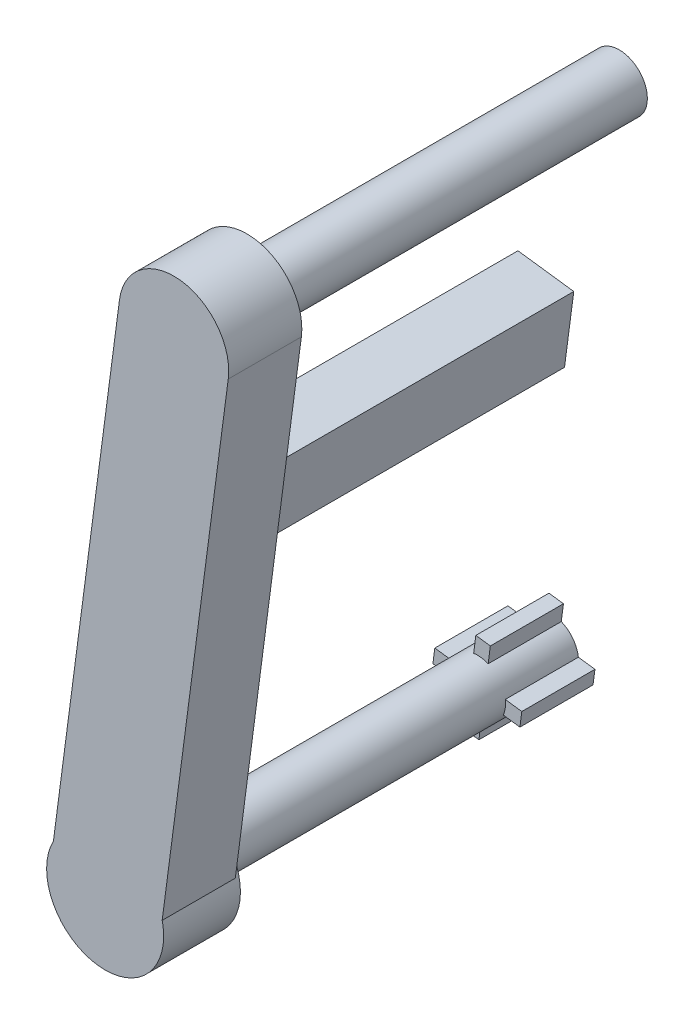
ISO-10303-21;
HEADER;
FILE_DESCRIPTION(('STEP AP214'),'2;1');
FILE_NAME('part.step','',(''),(''),'','','');
FILE_SCHEMA(('AUTOMOTIVE_DESIGN { 1 0 10303 214 1 1 1 1 }'));
ENDSEC;
DATA;
#1=APPLICATION_CONTEXT('core data for automotive mechanical design processes');
#2=APPLICATION_PROTOCOL_DEFINITION('international standard','automotive_design',2000,#1);
#3=PRODUCT_CONTEXT('',#1,'mechanical');
#4=PRODUCT('Part','Part','',(#3));
#5=PRODUCT_RELATED_PRODUCT_CATEGORY('part','',(#4));
#6=PRODUCT_DEFINITION_FORMATION('','',#4);
#7=PRODUCT_DEFINITION_CONTEXT('part definition',#1,'design');
#8=PRODUCT_DEFINITION('design','',#6,#7);
#9=PRODUCT_DEFINITION_SHAPE('','',#8);
#10=(LENGTH_UNIT() NAMED_UNIT(*) SI_UNIT(.MILLI.,.METRE.));
#11=(NAMED_UNIT(*) PLANE_ANGLE_UNIT() SI_UNIT($,.RADIAN.));
#12=(NAMED_UNIT(*) SI_UNIT($,.STERADIAN.) SOLID_ANGLE_UNIT());
#13=UNCERTAINTY_MEASURE_WITH_UNIT(LENGTH_MEASURE(1.E-05),#10,'distance_accuracy_value','');
#14=(GEOMETRIC_REPRESENTATION_CONTEXT(3) GLOBAL_UNCERTAINTY_ASSIGNED_CONTEXT((#13)) GLOBAL_UNIT_ASSIGNED_CONTEXT((#10,
#11,#12)) REPRESENTATION_CONTEXT('',''));
#15=CARTESIAN_POINT('',(0.,0.,0.));
#16=DIRECTION('',(0.,0.,1.));
#17=DIRECTION('',(1.,0.,0.));
#18=AXIS2_PLACEMENT_3D('',#15,#16,#17);
#19=CARTESIAN_POINT('',(9.39788583984373,71.3840300189143,-10.));
#20=DIRECTION('',(0.,0.,1.));
#21=DIRECTION('',(1.,0.,0.));
#22=AXIS2_PLACEMENT_3D('',#19,#20,#21);
#23=PLANE('',#22);
#24=CARTESIAN_POINT('',(0.,0.,-10.));
#25=DIRECTION('',(0.,0.,1.));
#26=DIRECTION('',(1.,0.,0.));
#27=AXIS2_PLACEMENT_3D('',#24,#25,#26);
#28=CIRCLE('',#27,8.);
#29=CARTESIAN_POINT('',(-7.07246691957423,3.73901212508444,-10.));
#30=VERTEX_POINT('',#29);
#31=CARTESIAN_POINT('',(7.79920600103294,1.78111924178366,-10.));
#32=VERTEX_POINT('',#31);
#33=EDGE_CURVE('E399',#30,#32,#28,.F.);
#34=ORIENTED_EDGE('',*,*,#33,.F.);
#35=DIRECTION('',(-0.130526192220052,-0.99144486137381,0.));
#36=VECTOR('',#35,1.);
#37=CARTESIAN_POINT('',(1.96204937954016,72.3629764605648,-10.));
#38=LINE('',#37,#36);
#39=CARTESIAN_POINT('',(1.96204937954016,72.3629764605648,-10.));
#40=VERTEX_POINT('',#39);
#41=EDGE_CURVE('E255',#40,#30,#38,.T.);
#42=ORIENTED_EDGE('',*,*,#41,.F.);
#43=CARTESIAN_POINT('',(9.39788583984373,71.3840300189143,-10.));
#44=DIRECTION('',(0.,0.,1.));
#45=DIRECTION('',(1.,0.,0.));
#46=AXIS2_PLACEMENT_3D('',#43,#44,#45);
#47=CIRCLE('',#46,7.5);
#48=CARTESIAN_POINT('',(16.8337223001473,70.405083577264,-10.));
#49=VERTEX_POINT('',#48);
#50=EDGE_CURVE('E252',#49,#40,#47,.T.);
#51=ORIENTED_EDGE('',*,*,#50,.F.);
#52=DIRECTION('',(0.130526192220052,0.99144486137381,0.));
#53=VECTOR('',#52,1.);
#54=CARTESIAN_POINT('',(16.8337223001473,70.405083577264,-10.));
#55=LINE('',#54,#53);
#56=EDGE_CURVE('E259',#32,#49,#55,.T.);
#57=ORIENTED_EDGE('',*,*,#56,.F.);
#58=EDGE_LOOP('',(#34,#42,#51,#57));
#59=FACE_BOUND('',#58,.T.);
#60=CARTESIAN_POINT('',(9.39788583984373,71.3840300189143,-10.));
#61=DIRECTION('',(0.,0.,1.));
#62=DIRECTION('',(1.,0.,0.));
#63=AXIS2_PLACEMENT_3D('',#60,#61,#62);
#64=CIRCLE('',#63,4.5);
#65=CARTESIAN_POINT('',(13.8978858398437,71.3840300189143,-10.));
#66=VERTEX_POINT('',#65);
#67=EDGE_CURVE('E51',#66,#66,#64,.F.);
#68=ORIENTED_EDGE('',*,*,#67,.F.);
#69=EDGE_LOOP('',(#68));
#70=FACE_BOUND('',#69,.T.);
#71=DIRECTION('',(-0.99144486137381,0.130526192220054,0.));
#72=VECTOR('',#71,1.);
#73=CARTESIAN_POINT('',(9.31874171836468,41.2868750668588,-10.));
#74=LINE('',#73,#72);
#75=CARTESIAN_POINT('',(9.31874171836468,41.2868750668588,-10.));
#76=VERTEX_POINT('',#75);
#77=CARTESIAN_POINT('',(1.68521115270317,42.2918484312379,-10.));
#78=VERTEX_POINT('',#77);
#79=EDGE_CURVE('E63',#76,#78,#74,.T.);
#80=ORIENTED_EDGE('',*,*,#79,.F.);
#81=DIRECTION('',(-0.130526192220054,-0.99144486137381,0.));
#82=VECTOR('',#81,1.);
#83=CARTESIAN_POINT('',(10.5848457828992,50.9038902221848,-10.));
#84=LINE('',#83,#82);
#85=CARTESIAN_POINT('',(10.5848457828992,50.9038902221848,-10.));
#86=VERTEX_POINT('',#85);
#87=EDGE_CURVE('E68',#86,#76,#84,.T.);
#88=ORIENTED_EDGE('',*,*,#87,.F.);
#89=DIRECTION('',(0.99144486137381,-0.130526192220053,0.));
#90=VECTOR('',#89,1.);
#91=CARTESIAN_POINT('',(2.95131521723769,51.9088635865639,-10.));
#92=LINE('',#91,#90);
#93=CARTESIAN_POINT('',(2.95131521723769,51.9088635865639,-10.));
#94=VERTEX_POINT('',#93);
#95=EDGE_CURVE('E206',#94,#86,#92,.T.);
#96=ORIENTED_EDGE('',*,*,#95,.F.);
#97=DIRECTION('',(0.130526192220054,0.99144486137381,0.));
#98=VECTOR('',#97,1.);
#99=CARTESIAN_POINT('',(1.68521115270317,42.2918484312379,-10.));
#100=LINE('',#99,#98);
#101=EDGE_CURVE('E209',#78,#94,#100,.T.);
#102=ORIENTED_EDGE('',*,*,#101,.F.);
#103=EDGE_LOOP('',(#80,#88,#96,#102));
#104=FACE_BOUND('',#103,.T.);
#105=ADVANCED_FACE('F47',(#59,#70,#104),#23,.F.);
#106=CARTESIAN_POINT('',(0.,0.,-10.5));
#107=DIRECTION('',(0.,0.,1.));
#108=DIRECTION('',(1.,0.,0.));
#109=AXIS2_PLACEMENT_3D('',#106,#107,#108);
#110=CYLINDRICAL_SURFACE('',#109,8.);
#111=DIRECTION('',(0.,0.,1.));
#112=VECTOR('',#111,1.);
#113=CARTESIAN_POINT('',(7.79920600103294,1.78111924178366,-10.));
#114=LINE('',#113,#112);
#115=CARTESIAN_POINT('',(7.79920600103294,1.78111924178366,0.));
#116=VERTEX_POINT('',#115);
#117=EDGE_CURVE('E272',#32,#116,#114,.T.);
#118=ORIENTED_EDGE('',*,*,#117,.T.);
#119=CARTESIAN_POINT('',(0.,0.,0.));
#120=DIRECTION('',(0.,0.,1.));
#121=DIRECTION('',(1.,0.,0.));
#122=AXIS2_PLACEMENT_3D('',#119,#120,#121);
#123=CIRCLE('',#122,8.);
#124=CARTESIAN_POINT('',(-7.07246691957424,3.73901212508439,0.));
#125=VERTEX_POINT('',#124);
#126=EDGE_CURVE('E349',#125,#116,#123,.T.);
#127=ORIENTED_EDGE('',*,*,#126,.F.);
#128=DIRECTION('',(0.,0.,1.));
#129=VECTOR('',#128,1.);
#130=CARTESIAN_POINT('',(-7.07246691957423,3.73901212508444,-10.));
#131=LINE('',#130,#129);
#132=EDGE_CURVE('E275',#30,#125,#131,.T.);
#133=ORIENTED_EDGE('',*,*,#132,.F.);
#134=ORIENTED_EDGE('',*,*,#33,.T.);
#135=EDGE_LOOP('',(#118,#127,#133,#134));
#136=FACE_BOUND('',#135,.T.);
#137=CARTESIAN_POINT('',(0.,0.,-10.5));
#138=DIRECTION('',(0.,0.,1.));
#139=DIRECTION('',(1.,0.,0.));
#140=AXIS2_PLACEMENT_3D('',#137,#138,#139);
#141=CIRCLE('',#140,8.);
#142=CARTESIAN_POINT('',(8.,0.,-10.5));
#143=VERTEX_POINT('',#142);
#144=EDGE_CURVE('E371',#143,#143,#141,.T.);
#145=ORIENTED_EDGE('',*,*,#144,.T.);
#146=EDGE_LOOP('',(#145));
#147=FACE_BOUND('',#146,.T.);
#148=ADVANCED_FACE('F49',(#136,#147),#110,.T.);
#149=CARTESIAN_POINT('',(0.,0.,-10.5));
#150=DIRECTION('',(0.,0.,1.));
#151=DIRECTION('',(1.,0.,0.));
#152=AXIS2_PLACEMENT_3D('',#149,#150,#151);
#153=PLANE('',#152);
#154=CARTESIAN_POINT('',(0.,0.,-10.5));
#155=DIRECTION('',(0.,0.,-1.));
#156=DIRECTION('',(-1.,0.,0.));
#157=AXIS2_PLACEMENT_3D('',#154,#155,#156);
#158=CIRCLE('',#157,3.85);
#159=CARTESIAN_POINT('',(-3.85,0.,-10.5));
#160=VERTEX_POINT('',#159);
#161=EDGE_CURVE('E367',#160,#160,#158,.T.);
#162=ORIENTED_EDGE('',*,*,#161,.F.);
#163=EDGE_LOOP('',(#162));
#164=FACE_BOUND('',#163,.T.);
#165=ORIENTED_EDGE('',*,*,#144,.F.);
#166=EDGE_LOOP('',(#165));
#167=FACE_BOUND('',#166,.T.);
#168=ADVANCED_FACE('F501',(#164,#167),#153,.F.);
#169=CARTESIAN_POINT('',(0.,0.,0.));
#170=DIRECTION('',(0.,0.,1.));
#171=DIRECTION('',(1.,0.,0.));
#172=AXIS2_PLACEMENT_3D('',#169,#170,#171);
#173=PLANE('',#172);
#174=ORIENTED_EDGE('',*,*,#126,.T.);
#175=DIRECTION('',(0.130526192220052,0.99144486137381,0.));
#176=VECTOR('',#175,1.);
#177=CARTESIAN_POINT('',(16.8337223001473,70.405083577264,0.));
#178=LINE('',#177,#176);
#179=CARTESIAN_POINT('',(16.8337223001473,70.405083577264,0.));
#180=VERTEX_POINT('',#179);
#181=EDGE_CURVE('E256',#116,#180,#178,.T.);
#182=ORIENTED_EDGE('',*,*,#181,.T.);
#183=CARTESIAN_POINT('',(9.39788583984373,71.3840300189143,0.));
#184=DIRECTION('',(0.,0.,1.));
#185=DIRECTION('',(1.,0.,0.));
#186=AXIS2_PLACEMENT_3D('',#183,#184,#185);
#187=CIRCLE('',#186,7.5);
#188=CARTESIAN_POINT('',(1.96204937954016,72.3629764605648,0.));
#189=VERTEX_POINT('',#188);
#190=EDGE_CURVE('E251',#180,#189,#187,.T.);
#191=ORIENTED_EDGE('',*,*,#190,.T.);
#192=DIRECTION('',(-0.130526192220052,-0.99144486137381,0.));
#193=VECTOR('',#192,1.);
#194=CARTESIAN_POINT('',(1.96204937954016,72.3629764605648,0.));
#195=LINE('',#194,#193);
#196=EDGE_CURVE('E265',#189,#125,#195,.T.);
#197=ORIENTED_EDGE('',*,*,#196,.T.);
#198=EDGE_LOOP('',(#174,#182,#191,#197));
#199=FACE_BOUND('',#198,.T.);
#200=ADVANCED_FACE('F552',(#199),#173,.T.);
#201=CARTESIAN_POINT('',(0.,0.,-70.5));
#202=DIRECTION('',(0.,0.,1.));
#203=DIRECTION('',(1.,0.,0.));
#204=AXIS2_PLACEMENT_3D('',#201,#202,#203);
#205=CYLINDRICAL_SURFACE('',#204,3.85);
#206=DIRECTION('',(0.,0.,1.));
#207=VECTOR('',#206,1.);
#208=CARTESIAN_POINT('',(3.8165816539488,0.506166453591544,-70.5));
#209=LINE('',#208,#207);
#210=CARTESIAN_POINT('',(3.8165816539488,0.506166453591544,-50.9));
#211=VERTEX_POINT('',#210);
#212=CARTESIAN_POINT('',(3.8165816539488,0.506166453591544,-60.9));
#213=VERTEX_POINT('',#212);
#214=EDGE_CURVE('E370',#211,#213,#209,.F.);
#215=ORIENTED_EDGE('',*,*,#214,.T.);
#216=CARTESIAN_POINT('',(0.,0.,-60.9));
#217=DIRECTION('',(0.,0.,1.));
#218=DIRECTION('',(1.,0.,0.));
#219=AXIS2_PLACEMENT_3D('',#216,#217,#218);
#220=CIRCLE('',#219,3.85);
#221=CARTESIAN_POINT('',(1.47672326915606,3.55552926950869,-60.9));
#222=VERTEX_POINT('',#221);
#223=EDGE_CURVE('E271',#222,#213,#220,.F.);
#224=ORIENTED_EDGE('',*,*,#223,.F.);
#225=DIRECTION('',(0.,0.,1.));
#226=VECTOR('',#225,1.);
#227=CARTESIAN_POINT('',(1.47672326915606,3.55552926950869,-70.5));
#228=LINE('',#227,#226);
#229=CARTESIAN_POINT('',(1.47672326915606,3.55552926950869,-50.9));
#230=VERTEX_POINT('',#229);
#231=EDGE_CURVE('E398',#222,#230,#228,.T.);
#232=ORIENTED_EDGE('',*,*,#231,.T.);
#233=CARTESIAN_POINT('',(0.,0.,-50.9));
#234=DIRECTION('',(0.,0.,1.));
#235=DIRECTION('',(1.,0.,0.));
#236=AXIS2_PLACEMENT_3D('',#233,#234,#235);
#237=CIRCLE('',#236,3.85);
#238=CARTESIAN_POINT('',(-0.50616645359156,3.8165816539488,-50.9));
#239=VERTEX_POINT('',#238);
#240=EDGE_CURVE('E383',#230,#239,#237,.T.);
#241=ORIENTED_EDGE('',*,*,#240,.T.);
#242=DIRECTION('',(0.,0.,1.));
#243=VECTOR('',#242,1.);
#244=CARTESIAN_POINT('',(-0.50616645359156,3.8165816539488,-70.5));
#245=LINE('',#244,#243);
#246=CARTESIAN_POINT('',(-0.506166453591559,3.8165816539488,-60.9));
#247=VERTEX_POINT('',#246);
#248=EDGE_CURVE('E395',#239,#247,#245,.F.);
#249=ORIENTED_EDGE('',*,*,#248,.T.);
#250=CARTESIAN_POINT('',(-3.5555292695087,1.47672326915604,-60.9));
#251=VERTEX_POINT('',#250);
#252=EDGE_CURVE('E448',#251,#247,#220,.F.);
#253=ORIENTED_EDGE('',*,*,#252,.F.);
#254=DIRECTION('',(0.,0.,1.));
#255=VECTOR('',#254,1.);
#256=CARTESIAN_POINT('',(-3.5555292695087,1.47672326915604,-70.5));
#257=LINE('',#256,#255);
#258=CARTESIAN_POINT('',(-3.5555292695087,1.47672326915604,-50.9));
#259=VERTEX_POINT('',#258);
#260=EDGE_CURVE('E392',#251,#259,#257,.T.);
#261=ORIENTED_EDGE('',*,*,#260,.T.);
#262=CARTESIAN_POINT('',(-3.8165816539488,-0.506166453591584,-50.9));
#263=VERTEX_POINT('',#262);
#264=EDGE_CURVE('E394',#259,#263,#237,.T.);
#265=ORIENTED_EDGE('',*,*,#264,.T.);
#266=DIRECTION('',(0.,0.,1.));
#267=VECTOR('',#266,1.);
#268=CARTESIAN_POINT('',(-3.8165816539488,-0.506166453591584,-70.5));
#269=LINE('',#268,#267);
#270=CARTESIAN_POINT('',(-3.8165816539488,-0.506166453591584,-60.9));
#271=VERTEX_POINT('',#270);
#272=EDGE_CURVE('E389',#263,#271,#269,.F.);
#273=ORIENTED_EDGE('',*,*,#272,.T.);
#274=CARTESIAN_POINT('',(-1.47672326915605,-3.5555292695087,-60.9));
#275=VERTEX_POINT('',#274);
#276=EDGE_CURVE('E282',#275,#271,#220,.F.);
#277=ORIENTED_EDGE('',*,*,#276,.F.);
#278=DIRECTION('',(0.,0.,1.));
#279=VECTOR('',#278,1.);
#280=CARTESIAN_POINT('',(-1.47672326915605,-3.5555292695087,-70.5));
#281=LINE('',#280,#279);
#282=CARTESIAN_POINT('',(-1.47672326915605,-3.5555292695087,-50.9));
#283=VERTEX_POINT('',#282);
#284=EDGE_CURVE('E387',#275,#283,#281,.T.);
#285=ORIENTED_EDGE('',*,*,#284,.T.);
#286=CARTESIAN_POINT('',(0.506166453591571,-3.8165816539488,-50.9));
#287=VERTEX_POINT('',#286);
#288=EDGE_CURVE('E384',#283,#287,#237,.T.);
#289=ORIENTED_EDGE('',*,*,#288,.T.);
#290=DIRECTION('',(0.,0.,1.));
#291=VECTOR('',#290,1.);
#292=CARTESIAN_POINT('',(0.506166453591571,-3.8165816539488,-70.5));
#293=LINE('',#292,#291);
#294=CARTESIAN_POINT('',(0.506166453591571,-3.8165816539488,-60.9));
#295=VERTEX_POINT('',#294);
#296=EDGE_CURVE('E382',#287,#295,#293,.F.);
#297=ORIENTED_EDGE('',*,*,#296,.T.);
#298=CARTESIAN_POINT('',(3.55552926950869,-1.47672326915608,-60.9));
#299=VERTEX_POINT('',#298);
#300=EDGE_CURVE('E279',#299,#295,#220,.F.);
#301=ORIENTED_EDGE('',*,*,#300,.F.);
#302=DIRECTION('',(0.,0.,1.));
#303=VECTOR('',#302,1.);
#304=CARTESIAN_POINT('',(3.55552926950869,-1.47672326915608,-70.5));
#305=LINE('',#304,#303);
#306=CARTESIAN_POINT('',(3.55552926950869,-1.47672326915608,-50.9));
#307=VERTEX_POINT('',#306);
#308=EDGE_CURVE('E378',#299,#307,#305,.T.);
#309=ORIENTED_EDGE('',*,*,#308,.T.);
#310=EDGE_CURVE('E380',#307,#211,#237,.T.);
#311=ORIENTED_EDGE('',*,*,#310,.T.);
#312=EDGE_LOOP('',(#215,#224,#232,#241,#249,#253,#261,#265,#273,#277,#285,#289,#297,#301,#309,#311));
#313=FACE_BOUND('',#312,.T.);
#314=ORIENTED_EDGE('',*,*,#161,.T.);
#315=EDGE_LOOP('',(#314));
#316=FACE_BOUND('',#315,.T.);
#317=ADVANCED_FACE('F411',(#313,#316),#205,.T.);
#318=CARTESIAN_POINT('',(5.81814297602283,-1.77460201469414,-50.9));
#319=DIRECTION('',(0.99144486137381,-0.130526192220052,0.));
#320=DIRECTION('',(0.130526192220052,0.99144486137381,0.));
#321=AXIS2_PLACEMENT_3D('',#318,#319,#320);
#322=PLANE('',#321);
#323=DIRECTION('',(-0.130526192220052,-0.99144486137381,0.));
#324=VECTOR('',#323,1.);
#325=CARTESIAN_POINT('',(5.81814297602283,-1.77460201469414,-60.9));
#326=LINE('',#325,#324);
#327=CARTESIAN_POINT('',(6.07919536046293,0.208287708053485,-60.9));
#328=VERTEX_POINT('',#327);
#329=CARTESIAN_POINT('',(5.81814297602283,-1.77460201469414,-60.9));
#330=VERTEX_POINT('',#329);
#331=EDGE_CURVE('E321',#328,#330,#326,.T.);
#332=ORIENTED_EDGE('',*,*,#331,.F.);
#333=DIRECTION('',(0.,0.,-1.));
#334=VECTOR('',#333,1.);
#335=CARTESIAN_POINT('',(6.07919536046293,0.208287708053485,-50.9));
#336=LINE('',#335,#334);
#337=CARTESIAN_POINT('',(6.07919536046293,0.208287708053485,-50.9));
#338=VERTEX_POINT('',#337);
#339=EDGE_CURVE('E316',#338,#328,#336,.T.);
#340=ORIENTED_EDGE('',*,*,#339,.F.);
#341=DIRECTION('',(-0.130526192220052,-0.99144486137381,0.));
#342=VECTOR('',#341,1.);
#343=CARTESIAN_POINT('',(5.81814297602283,-1.77460201469414,-50.9));
#344=LINE('',#343,#342);
#345=CARTESIAN_POINT('',(5.81814297602283,-1.77460201469414,-50.9));
#346=VERTEX_POINT('',#345);
#347=EDGE_CURVE('E289',#338,#346,#344,.T.);
#348=ORIENTED_EDGE('',*,*,#347,.T.);
#349=DIRECTION('',(0.,0.,-1.));
#350=VECTOR('',#349,1.);
#351=CARTESIAN_POINT('',(5.81814297602283,-1.77460201469414,-50.9));
#352=LINE('',#351,#350);
#353=EDGE_CURVE('E363',#346,#330,#352,.T.);
#354=ORIENTED_EDGE('',*,*,#353,.T.);
#355=EDGE_LOOP('',(#332,#340,#348,#354));
#356=FACE_BOUND('',#355,.T.);
#357=ADVANCED_FACE('F442',(#356),#322,.T.);
#358=CARTESIAN_POINT('',(0.,0.,-50.9));
#359=DIRECTION('',(0.,0.,1.));
#360=DIRECTION('',(1.,0.,0.));
#361=AXIS2_PLACEMENT_3D('',#358,#359,#360);
#362=PLANE('',#361);
#363=ORIENTED_EDGE('',*,*,#310,.F.);
#364=DIRECTION('',(-0.99144486137381,0.130526192220052,0.));
#365=VECTOR('',#364,1.);
#366=CARTESIAN_POINT('',(0.860918669153769,-1.12197105359388,-50.9));
#367=LINE('',#366,#365);
#368=EDGE_CURVE('E292',#346,#307,#367,.T.);
#369=ORIENTED_EDGE('',*,*,#368,.F.);
#370=ORIENTED_EDGE('',*,*,#347,.F.);
#371=DIRECTION('',(0.991444861373811,-0.130526192220051,0.));
#372=VECTOR('',#371,1.);
#373=CARTESIAN_POINT('',(6.07919536046293,0.208287708053485,-50.9));
#374=LINE('',#373,#372);
#375=EDGE_CURVE('E286',#211,#338,#374,.T.);
#376=ORIENTED_EDGE('',*,*,#375,.F.);
#377=EDGE_LOOP('',(#363,#369,#370,#376));
#378=FACE_BOUND('',#377,.T.);
#379=ADVANCED_FACE('F437',(#378),#362,.T.);
#380=CARTESIAN_POINT('',(6.07919536046293,0.208287708053485,-50.9));
#381=DIRECTION('',(0.130526192220051,0.991444861373811,0.));
#382=DIRECTION('',(-0.991444861373811,0.130526192220051,0.));
#383=AXIS2_PLACEMENT_3D('',#380,#381,#382);
#384=PLANE('',#383);
#385=ORIENTED_EDGE('',*,*,#214,.F.);
#386=ORIENTED_EDGE('',*,*,#375,.T.);
#387=ORIENTED_EDGE('',*,*,#339,.T.);
#388=DIRECTION('',(0.991444861373811,-0.130526192220051,0.));
#389=VECTOR('',#388,1.);
#390=CARTESIAN_POINT('',(6.07919536046293,0.208287708053485,-60.9));
#391=LINE('',#390,#389);
#392=EDGE_CURVE('E319',#213,#328,#391,.T.);
#393=ORIENTED_EDGE('',*,*,#392,.F.);
#394=EDGE_LOOP('',(#385,#386,#387,#393));
#395=FACE_BOUND('',#394,.T.);
#396=ADVANCED_FACE('F446',(#395),#384,.T.);
#397=CARTESIAN_POINT('',(0.860918669153769,-1.12197105359388,-50.9));
#398=DIRECTION('',(-0.130526192220052,-0.99144486137381,0.));
#399=DIRECTION('',(0.99144486137381,-0.130526192220052,0.));
#400=AXIS2_PLACEMENT_3D('',#397,#398,#399);
#401=PLANE('',#400);
#402=ORIENTED_EDGE('',*,*,#308,.F.);
#403=DIRECTION('',(-0.99144486137381,0.130526192220052,0.));
#404=VECTOR('',#403,1.);
#405=CARTESIAN_POINT('',(0.860918669153769,-1.12197105359388,-60.9));
#406=LINE('',#405,#404);
#407=EDGE_CURVE('E324',#330,#299,#406,.T.);
#408=ORIENTED_EDGE('',*,*,#407,.F.);
#409=ORIENTED_EDGE('',*,*,#353,.F.);
#410=ORIENTED_EDGE('',*,*,#368,.T.);
#411=EDGE_LOOP('',(#402,#408,#409,#410));
#412=FACE_BOUND('',#411,.T.);
#413=ADVANCED_FACE('F433',(#412),#401,.T.);
#414=CARTESIAN_POINT('',(-1.77460201469411,-5.81814297602284,-50.9));
#415=DIRECTION('',(-0.130526192220052,-0.99144486137381,0.));
#416=DIRECTION('',(0.99144486137381,-0.130526192220052,0.));
#417=AXIS2_PLACEMENT_3D('',#414,#415,#416);
#418=PLANE('',#417);
#419=DIRECTION('',(-0.99144486137381,0.130526192220052,0.));
#420=VECTOR('',#419,1.);
#421=CARTESIAN_POINT('',(-1.77460201469411,-5.81814297602284,-60.9));
#422=LINE('',#421,#420);
#423=CARTESIAN_POINT('',(0.208287708053507,-6.07919536046295,-60.9));
#424=VERTEX_POINT('',#423);
#425=CARTESIAN_POINT('',(-1.77460201469411,-5.81814297602284,-60.9));
#426=VERTEX_POINT('',#425);
#427=EDGE_CURVE('E329',#424,#426,#422,.T.);
#428=ORIENTED_EDGE('',*,*,#427,.F.);
#429=DIRECTION('',(0.,0.,-1.));
#430=VECTOR('',#429,1.);
#431=CARTESIAN_POINT('',(0.208287708053507,-6.07919536046295,-50.9));
#432=LINE('',#431,#430);
#433=CARTESIAN_POINT('',(0.208287708053507,-6.07919536046295,-50.9));
#434=VERTEX_POINT('',#433);
#435=EDGE_CURVE('E360',#434,#424,#432,.T.);
#436=ORIENTED_EDGE('',*,*,#435,.F.);
#437=DIRECTION('',(-0.99144486137381,0.130526192220052,0.));
#438=VECTOR('',#437,1.);
#439=CARTESIAN_POINT('',(-1.77460201469411,-5.81814297602284,-50.9));
#440=LINE('',#439,#438);
#441=CARTESIAN_POINT('',(-1.77460201469411,-5.81814297602284,-50.9));
#442=VERTEX_POINT('',#441);
#443=EDGE_CURVE('E297',#434,#442,#440,.T.);
#444=ORIENTED_EDGE('',*,*,#443,.T.);
#445=DIRECTION('',(0.,0.,-1.));
#446=VECTOR('',#445,1.);
#447=CARTESIAN_POINT('',(-1.77460201469411,-5.81814297602284,-50.9));
#448=LINE('',#447,#446);
#449=EDGE_CURVE('E358',#442,#426,#448,.T.);
#450=ORIENTED_EDGE('',*,*,#449,.T.);
#451=EDGE_LOOP('',(#428,#436,#444,#450));
#452=FACE_BOUND('',#451,.T.);
#453=ADVANCED_FACE('F425',(#452),#418,.T.);
#454=ORIENTED_EDGE('',*,*,#288,.F.);
#455=DIRECTION('',(0.130526192220052,0.99144486137381,0.));
#456=VECTOR('',#455,1.);
#457=CARTESIAN_POINT('',(-1.12197105359385,-0.860918669153784,-50.9));
#458=LINE('',#457,#456);
#459=EDGE_CURVE('E300',#442,#283,#458,.T.);
#460=ORIENTED_EDGE('',*,*,#459,.F.);
#461=ORIENTED_EDGE('',*,*,#443,.F.);
#462=DIRECTION('',(-0.130526192220052,-0.99144486137381,0.));
#463=VECTOR('',#462,1.);
#464=CARTESIAN_POINT('',(0.208287708053507,-6.07919536046295,-50.9));
#465=LINE('',#464,#463);
#466=EDGE_CURVE('E295',#287,#434,#465,.T.);
#467=ORIENTED_EDGE('',*,*,#466,.F.);
#468=EDGE_LOOP('',(#454,#460,#461,#467));
#469=FACE_BOUND('',#468,.T.);
#470=ADVANCED_FACE('F422',(#469),#362,.T.);
#471=CARTESIAN_POINT('',(0.208287708053507,-6.07919536046295,-50.9));
#472=DIRECTION('',(0.99144486137381,-0.130526192220052,0.));
#473=DIRECTION('',(0.130526192220052,0.99144486137381,0.));
#474=AXIS2_PLACEMENT_3D('',#471,#472,#473);
#475=PLANE('',#474);
#476=ORIENTED_EDGE('',*,*,#296,.F.);
#477=ORIENTED_EDGE('',*,*,#466,.T.);
#478=ORIENTED_EDGE('',*,*,#435,.T.);
#479=DIRECTION('',(-0.130526192220052,-0.99144486137381,0.));
#480=VECTOR('',#479,1.);
#481=CARTESIAN_POINT('',(0.208287708053507,-6.07919536046295,-60.9));
#482=LINE('',#481,#480);
#483=EDGE_CURVE('E327',#295,#424,#482,.T.);
#484=ORIENTED_EDGE('',*,*,#483,.F.);
#485=EDGE_LOOP('',(#476,#477,#478,#484));
#486=FACE_BOUND('',#485,.T.);
#487=ADVANCED_FACE('F419',(#486),#475,.T.);
#488=CARTESIAN_POINT('',(-1.12197105359385,-0.860918669153784,-50.9));
#489=DIRECTION('',(-0.99144486137381,0.130526192220052,0.));
#490=DIRECTION('',(-0.130526192220052,-0.99144486137381,0.));
#491=AXIS2_PLACEMENT_3D('',#488,#489,#490);
#492=PLANE('',#491);
#493=ORIENTED_EDGE('',*,*,#284,.F.);
#494=DIRECTION('',(0.130526192220052,0.99144486137381,0.));
#495=VECTOR('',#494,1.);
#496=CARTESIAN_POINT('',(-1.12197105359385,-0.860918669153784,-60.9));
#497=LINE('',#496,#495);
#498=EDGE_CURVE('E332',#426,#275,#497,.T.);
#499=ORIENTED_EDGE('',*,*,#498,.F.);
#500=ORIENTED_EDGE('',*,*,#449,.F.);
#501=ORIENTED_EDGE('',*,*,#459,.T.);
#502=EDGE_LOOP('',(#493,#499,#500,#501));
#503=FACE_BOUND('',#502,.T.);
#504=ADVANCED_FACE('F481',(#503),#492,.T.);
#505=CARTESIAN_POINT('',(-5.81814297602282,1.7746020146941,-50.9));
#506=DIRECTION('',(-0.99144486137381,0.130526192220052,0.));
#507=DIRECTION('',(-0.130526192220052,-0.99144486137381,0.));
#508=AXIS2_PLACEMENT_3D('',#505,#506,#507);
#509=PLANE('',#508);
#510=DIRECTION('',(0.130526192220052,0.99144486137381,0.));
#511=VECTOR('',#510,1.);
#512=CARTESIAN_POINT('',(-5.81814297602282,1.7746020146941,-60.9));
#513=LINE('',#512,#511);
#514=CARTESIAN_POINT('',(-6.07919536046293,-0.208287708053522,-60.9));
#515=VERTEX_POINT('',#514);
#516=CARTESIAN_POINT('',(-5.81814297602282,1.7746020146941,-60.9));
#517=VERTEX_POINT('',#516);
#518=EDGE_CURVE('E337',#515,#517,#513,.T.);
#519=ORIENTED_EDGE('',*,*,#518,.F.);
#520=DIRECTION('',(0.,0.,-1.));
#521=VECTOR('',#520,1.);
#522=CARTESIAN_POINT('',(-6.07919536046293,-0.208287708053522,-50.9));
#523=LINE('',#522,#521);
#524=CARTESIAN_POINT('',(-6.07919536046293,-0.208287708053522,-50.9));
#525=VERTEX_POINT('',#524);
#526=EDGE_CURVE('E355',#525,#515,#523,.T.);
#527=ORIENTED_EDGE('',*,*,#526,.F.);
#528=DIRECTION('',(0.130526192220052,0.99144486137381,0.));
#529=VECTOR('',#528,1.);
#530=CARTESIAN_POINT('',(-5.81814297602282,1.7746020146941,-50.9));
#531=LINE('',#530,#529);
#532=CARTESIAN_POINT('',(-5.81814297602282,1.7746020146941,-50.9));
#533=VERTEX_POINT('',#532);
#534=EDGE_CURVE('E305',#525,#533,#531,.T.);
#535=ORIENTED_EDGE('',*,*,#534,.T.);
#536=DIRECTION('',(0.,0.,-1.));
#537=VECTOR('',#536,1.);
#538=CARTESIAN_POINT('',(-5.81814297602282,1.7746020146941,-50.9));
#539=LINE('',#538,#537);
#540=EDGE_CURVE('E353',#533,#517,#539,.T.);
#541=ORIENTED_EDGE('',*,*,#540,.T.);
#542=EDGE_LOOP('',(#519,#527,#535,#541));
#543=FACE_BOUND('',#542,.T.);
#544=ADVANCED_FACE('F473',(#543),#509,.T.);
#545=ORIENTED_EDGE('',*,*,#264,.F.);
#546=DIRECTION('',(0.99144486137381,-0.130526192220052,0.));
#547=VECTOR('',#546,1.);
#548=CARTESIAN_POINT('',(-0.860918669153763,1.12197105359384,-50.9));
#549=LINE('',#548,#547);
#550=EDGE_CURVE('E308',#533,#259,#549,.T.);
#551=ORIENTED_EDGE('',*,*,#550,.F.);
#552=ORIENTED_EDGE('',*,*,#534,.F.);
#553=DIRECTION('',(-0.99144486137381,0.130526192220052,0.));
#554=VECTOR('',#553,1.);
#555=CARTESIAN_POINT('',(-6.07919536046293,-0.208287708053522,-50.9));
#556=LINE('',#555,#554);
#557=EDGE_CURVE('E303',#263,#525,#556,.T.);
#558=ORIENTED_EDGE('',*,*,#557,.F.);
#559=EDGE_LOOP('',(#545,#551,#552,#558));
#560=FACE_BOUND('',#559,.T.);
#561=ADVANCED_FACE('F476',(#560),#362,.T.);
#562=CARTESIAN_POINT('',(-6.07919536046293,-0.208287708053522,-50.9));
#563=DIRECTION('',(-0.130526192220052,-0.99144486137381,0.));
#564=DIRECTION('',(0.99144486137381,-0.130526192220052,0.));
#565=AXIS2_PLACEMENT_3D('',#562,#563,#564);
#566=PLANE('',#565);
#567=ORIENTED_EDGE('',*,*,#272,.F.);
#568=ORIENTED_EDGE('',*,*,#557,.T.);
#569=ORIENTED_EDGE('',*,*,#526,.T.);
#570=DIRECTION('',(-0.99144486137381,0.130526192220052,0.));
#571=VECTOR('',#570,1.);
#572=CARTESIAN_POINT('',(-6.07919536046293,-0.208287708053522,-60.9));
#573=LINE('',#572,#571);
#574=EDGE_CURVE('E335',#271,#515,#573,.T.);
#575=ORIENTED_EDGE('',*,*,#574,.F.);
#576=EDGE_LOOP('',(#567,#568,#569,#575));
#577=FACE_BOUND('',#576,.T.);
#578=ADVANCED_FACE('F479',(#577),#566,.T.);
#579=CARTESIAN_POINT('',(-0.860918669153763,1.12197105359384,-50.9));
#580=DIRECTION('',(0.130526192220052,0.99144486137381,0.));
#581=DIRECTION('',(-0.99144486137381,0.130526192220052,0.));
#582=AXIS2_PLACEMENT_3D('',#579,#580,#581);
#583=PLANE('',#582);
#584=ORIENTED_EDGE('',*,*,#260,.F.);
#585=DIRECTION('',(0.99144486137381,-0.130526192220052,0.));
#586=VECTOR('',#585,1.);
#587=CARTESIAN_POINT('',(-0.860918669153763,1.12197105359384,-60.9));
#588=LINE('',#587,#586);
#589=EDGE_CURVE('E340',#517,#251,#588,.T.);
#590=ORIENTED_EDGE('',*,*,#589,.F.);
#591=ORIENTED_EDGE('',*,*,#540,.F.);
#592=ORIENTED_EDGE('',*,*,#550,.T.);
#593=EDGE_LOOP('',(#584,#590,#591,#592));
#594=FACE_BOUND('',#593,.T.);
#595=ADVANCED_FACE('F467',(#594),#583,.T.);
#596=CARTESIAN_POINT('',(1.12197105359386,0.860918669153741,-50.9));
#597=DIRECTION('',(0.99144486137381,-0.130526192220052,0.));
#598=DIRECTION('',(0.130526192220052,0.99144486137381,0.));
#599=AXIS2_PLACEMENT_3D('',#596,#597,#598);
#600=PLANE('',#599);
#601=ORIENTED_EDGE('',*,*,#231,.F.);
#602=DIRECTION('',(-0.130526192220052,-0.99144486137381,0.));
#603=VECTOR('',#602,1.);
#604=CARTESIAN_POINT('',(1.12197105359386,0.860918669153741,-60.9));
#605=LINE('',#604,#603);
#606=CARTESIAN_POINT('',(1.77460201469412,5.81814297602281,-60.9));
#607=VERTEX_POINT('',#606);
#608=EDGE_CURVE('E281',#607,#222,#605,.T.);
#609=ORIENTED_EDGE('',*,*,#608,.F.);
#610=DIRECTION('',(0.,0.,-1.));
#611=VECTOR('',#610,1.);
#612=CARTESIAN_POINT('',(1.77460201469412,5.81814297602281,-50.9));
#613=LINE('',#612,#611);
#614=CARTESIAN_POINT('',(1.77460201469412,5.81814297602281,-50.9));
#615=VERTEX_POINT('',#614);
#616=EDGE_CURVE('E347',#615,#607,#613,.T.);
#617=ORIENTED_EDGE('',*,*,#616,.F.);
#618=DIRECTION('',(-0.130526192220052,-0.99144486137381,0.));
#619=VECTOR('',#618,1.);
#620=CARTESIAN_POINT('',(1.12197105359386,0.860918669153741,-50.9));
#621=LINE('',#620,#619);
#622=EDGE_CURVE('E283',#615,#230,#621,.T.);
#623=ORIENTED_EDGE('',*,*,#622,.T.);
#624=EDGE_LOOP('',(#601,#609,#617,#623));
#625=FACE_BOUND('',#624,.T.);
#626=ADVANCED_FACE('F451',(#625),#600,.T.);
#627=CARTESIAN_POINT('',(-0.208287708053501,6.07919536046291,-50.9));
#628=DIRECTION('',(-0.99144486137381,0.130526192220052,0.));
#629=DIRECTION('',(-0.130526192220052,-0.99144486137381,0.));
#630=AXIS2_PLACEMENT_3D('',#627,#628,#629);
#631=PLANE('',#630);
#632=ORIENTED_EDGE('',*,*,#248,.F.);
#633=DIRECTION('',(0.130526192220052,0.99144486137381,0.));
#634=VECTOR('',#633,1.);
#635=CARTESIAN_POINT('',(-0.208287708053501,6.07919536046291,-50.9));
#636=LINE('',#635,#634);
#637=CARTESIAN_POINT('',(-0.208287708053501,6.07919536046291,-50.9));
#638=VERTEX_POINT('',#637);
#639=EDGE_CURVE('E311',#239,#638,#636,.T.);
#640=ORIENTED_EDGE('',*,*,#639,.T.);
#641=DIRECTION('',(0.,0.,-1.));
#642=VECTOR('',#641,1.);
#643=CARTESIAN_POINT('',(-0.208287708053501,6.07919536046291,-50.9));
#644=LINE('',#643,#642);
#645=CARTESIAN_POINT('',(-0.208287708053501,6.07919536046291,-60.9));
#646=VERTEX_POINT('',#645);
#647=EDGE_CURVE('E350',#638,#646,#644,.T.);
#648=ORIENTED_EDGE('',*,*,#647,.T.);
#649=DIRECTION('',(0.130526192220052,0.99144486137381,0.));
#650=VECTOR('',#649,1.);
#651=CARTESIAN_POINT('',(-0.208287708053501,6.07919536046291,-60.9));
#652=LINE('',#651,#650);
#653=EDGE_CURVE('E343',#247,#646,#652,.T.);
#654=ORIENTED_EDGE('',*,*,#653,.F.);
#655=EDGE_LOOP('',(#632,#640,#648,#654));
#656=FACE_BOUND('',#655,.T.);
#657=ADVANCED_FACE('F463',(#656),#631,.T.);
#658=ORIENTED_EDGE('',*,*,#240,.F.);
#659=ORIENTED_EDGE('',*,*,#622,.F.);
#660=DIRECTION('',(0.99144486137381,-0.130526192220052,0.));
#661=VECTOR('',#660,1.);
#662=CARTESIAN_POINT('',(1.77460201469412,5.81814297602281,-50.9));
#663=LINE('',#662,#661);
#664=EDGE_CURVE('E313',#638,#615,#663,.T.);
#665=ORIENTED_EDGE('',*,*,#664,.F.);
#666=ORIENTED_EDGE('',*,*,#639,.F.);
#667=EDGE_LOOP('',(#658,#659,#665,#666));
#668=FACE_BOUND('',#667,.T.);
#669=ADVANCED_FACE('F460',(#668),#362,.T.);
#670=CARTESIAN_POINT('',(0.,0.,-60.9));
#671=DIRECTION('',(0.,0.,1.));
#672=DIRECTION('',(1.,0.,0.));
#673=AXIS2_PLACEMENT_3D('',#670,#671,#672);
#674=PLANE('',#673);
#675=ORIENTED_EDGE('',*,*,#608,.T.);
#676=ORIENTED_EDGE('',*,*,#223,.T.);
#677=ORIENTED_EDGE('',*,*,#392,.T.);
#678=ORIENTED_EDGE('',*,*,#331,.T.);
#679=ORIENTED_EDGE('',*,*,#407,.T.);
#680=ORIENTED_EDGE('',*,*,#300,.T.);
#681=ORIENTED_EDGE('',*,*,#483,.T.);
#682=ORIENTED_EDGE('',*,*,#427,.T.);
#683=ORIENTED_EDGE('',*,*,#498,.T.);
#684=ORIENTED_EDGE('',*,*,#276,.T.);
#685=ORIENTED_EDGE('',*,*,#574,.T.);
#686=ORIENTED_EDGE('',*,*,#518,.T.);
#687=ORIENTED_EDGE('',*,*,#589,.T.);
#688=ORIENTED_EDGE('',*,*,#252,.T.);
#689=ORIENTED_EDGE('',*,*,#653,.T.);
#690=DIRECTION('',(0.99144486137381,-0.130526192220052,0.));
#691=VECTOR('',#690,1.);
#692=CARTESIAN_POINT('',(1.77460201469412,5.81814297602281,-60.9));
#693=LINE('',#692,#691);
#694=EDGE_CURVE('E287',#646,#607,#693,.T.);
#695=ORIENTED_EDGE('',*,*,#694,.T.);
#696=EDGE_LOOP('',(#675,#676,#677,#678,#679,#680,#681,#682,#683,#684,#685,#686,#687,#688,#689,#695));
#697=FACE_BOUND('',#696,.T.);
#698=ADVANCED_FACE('F428',(#697),#674,.F.);
#699=CARTESIAN_POINT('',(1.77460201469412,5.81814297602281,-50.9));
#700=DIRECTION('',(0.130526192220052,0.99144486137381,0.));
#701=DIRECTION('',(-0.99144486137381,0.130526192220052,0.));
#702=AXIS2_PLACEMENT_3D('',#699,#700,#701);
#703=PLANE('',#702);
#704=ORIENTED_EDGE('',*,*,#694,.F.);
#705=ORIENTED_EDGE('',*,*,#647,.F.);
#706=ORIENTED_EDGE('',*,*,#664,.T.);
#707=ORIENTED_EDGE('',*,*,#616,.T.);
#708=EDGE_LOOP('',(#704,#705,#706,#707));
#709=FACE_BOUND('',#708,.T.);
#710=ADVANCED_FACE('F457',(#709),#703,.T.);
#711=CARTESIAN_POINT('',(9.39788583984373,71.3840300189143,-10.));
#712=DIRECTION('',(0.,0.,1.));
#713=DIRECTION('',(1.,0.,0.));
#714=AXIS2_PLACEMENT_3D('',#711,#712,#713);
#715=CYLINDRICAL_SURFACE('',#714,7.5);
#716=ORIENTED_EDGE('',*,*,#190,.F.);
#717=DIRECTION('',(0.,0.,1.));
#718=VECTOR('',#717,1.);
#719=CARTESIAN_POINT('',(16.8337223001473,70.405083577264,-10.));
#720=LINE('',#719,#718);
#721=EDGE_CURVE('E269',#49,#180,#720,.T.);
#722=ORIENTED_EDGE('',*,*,#721,.F.);
#723=ORIENTED_EDGE('',*,*,#50,.T.);
#724=DIRECTION('',(0.,0.,1.));
#725=VECTOR('',#724,1.);
#726=CARTESIAN_POINT('',(1.96204937954016,72.3629764605648,-10.));
#727=LINE('',#726,#725);
#728=EDGE_CURVE('E262',#40,#189,#727,.T.);
#729=ORIENTED_EDGE('',*,*,#728,.T.);
#730=EDGE_LOOP('',(#716,#722,#723,#729));
#731=FACE_BOUND('',#730,.T.);
#732=ADVANCED_FACE('F511',(#731),#715,.T.);
#733=CARTESIAN_POINT('',(16.8337223001473,70.405083577264,-10.));
#734=DIRECTION('',(0.99144486137381,-0.130526192220052,0.));
#735=DIRECTION('',(0.130526192220052,0.99144486137381,0.));
#736=AXIS2_PLACEMENT_3D('',#733,#734,#735);
#737=PLANE('',#736);
#738=ORIENTED_EDGE('',*,*,#181,.F.);
#739=ORIENTED_EDGE('',*,*,#117,.F.);
#740=ORIENTED_EDGE('',*,*,#56,.T.);
#741=ORIENTED_EDGE('',*,*,#721,.T.);
#742=EDGE_LOOP('',(#738,#739,#740,#741));
#743=FACE_BOUND('',#742,.T.);
#744=ADVANCED_FACE('F507',(#743),#737,.T.);
#745=CARTESIAN_POINT('',(1.96204937954016,72.3629764605648,-10.));
#746=DIRECTION('',(-0.99144486137381,0.130526192220052,0.));
#747=DIRECTION('',(-0.130526192220052,-0.99144486137381,0.));
#748=AXIS2_PLACEMENT_3D('',#745,#746,#747);
#749=PLANE('',#748);
#750=ORIENTED_EDGE('',*,*,#196,.F.);
#751=ORIENTED_EDGE('',*,*,#728,.F.);
#752=ORIENTED_EDGE('',*,*,#41,.T.);
#753=ORIENTED_EDGE('',*,*,#132,.T.);
#754=EDGE_LOOP('',(#750,#751,#752,#753));
#755=FACE_BOUND('',#754,.T.);
#756=ADVANCED_FACE('F510',(#755),#749,.T.);
#757=CARTESIAN_POINT('',(9.39788583984373,71.3840300189143,-10.5));
#758=DIRECTION('',(0.,0.,1.));
#759=DIRECTION('',(1.,0.,0.));
#760=AXIS2_PLACEMENT_3D('',#757,#758,#759);
#761=CYLINDRICAL_SURFACE('',#760,4.5);
#762=CARTESIAN_POINT('',(9.39788583984373,71.3840300189143,-10.5));
#763=DIRECTION('',(0.,0.,-1.));
#764=DIRECTION('',(-1.,0.,0.));
#765=AXIS2_PLACEMENT_3D('',#762,#763,#764);
#766=CIRCLE('',#765,4.5);
#767=CARTESIAN_POINT('',(4.89788583984373,71.3840300189143,-10.5));
#768=VERTEX_POINT('',#767);
#769=EDGE_CURVE('E248',#768,#768,#766,.T.);
#770=ORIENTED_EDGE('',*,*,#769,.F.);
#771=EDGE_LOOP('',(#770));
#772=FACE_BOUND('',#771,.T.);
#773=ORIENTED_EDGE('',*,*,#67,.T.);
#774=EDGE_LOOP('',(#773));
#775=FACE_BOUND('',#774,.T.);
#776=ADVANCED_FACE('F505',(#772,#775),#761,.T.);
#777=CARTESIAN_POINT('',(9.39788583984373,71.3840300189143,-10.5));
#778=DIRECTION('',(0.,0.,-1.));
#779=DIRECTION('',(-1.,0.,0.));
#780=AXIS2_PLACEMENT_3D('',#777,#778,#779);
#781=PLANE('',#780);
#782=CARTESIAN_POINT('',(9.39788583984373,71.3840300189143,-10.5));
#783=DIRECTION('',(0.,0.,-1.));
#784=DIRECTION('',(-1.,0.,0.));
#785=AXIS2_PLACEMENT_3D('',#782,#783,#784);
#786=CIRCLE('',#785,3.85000000000001);
#787=CARTESIAN_POINT('',(5.54788583984372,71.3840300189143,-10.5));
#788=VERTEX_POINT('',#787);
#789=EDGE_CURVE('E11',#788,#788,#786,.T.);
#790=ORIENTED_EDGE('',*,*,#789,.F.);
#791=EDGE_LOOP('',(#790));
#792=FACE_BOUND('',#791,.T.);
#793=ORIENTED_EDGE('',*,*,#769,.T.);
#794=EDGE_LOOP('',(#793));
#795=FACE_BOUND('',#794,.T.);
#796=ADVANCED_FACE('F655',(#792,#795),#781,.T.);
#797=CARTESIAN_POINT('',(9.39788583984373,71.3840300189143,-71.7894444302729));
#798=DIRECTION('',(0.,0.,1.));
#799=DIRECTION('',(1.,0.,0.));
#800=AXIS2_PLACEMENT_3D('',#797,#798,#799);
#801=CYLINDRICAL_SURFACE('',#800,3.85000000000001);
#802=CARTESIAN_POINT('',(9.39788583984373,71.3840300189143,-60.9));
#803=DIRECTION('',(0.,0.,1.));
#804=DIRECTION('',(1.,0.,0.));
#805=AXIS2_PLACEMENT_3D('',#802,#803,#804);
#806=CIRCLE('',#805,3.85000000000001);
#807=CARTESIAN_POINT('',(13.2478858398437,71.3840300189143,-60.9));
#808=VERTEX_POINT('',#807);
#809=EDGE_CURVE('E245',#808,#808,#806,.T.);
#810=ORIENTED_EDGE('',*,*,#809,.T.);
#811=EDGE_LOOP('',(#810));
#812=FACE_BOUND('',#811,.T.);
#813=ORIENTED_EDGE('',*,*,#789,.T.);
#814=EDGE_LOOP('',(#813));
#815=FACE_BOUND('',#814,.T.);
#816=ADVANCED_FACE('F663',(#812,#815),#801,.T.);
#817=CARTESIAN_POINT('',(0.,0.,-60.9));
#818=DIRECTION('',(0.,0.,1.));
#819=DIRECTION('',(1.,0.,0.));
#820=AXIS2_PLACEMENT_3D('',#817,#818,#819);
#821=PLANE('',#820);
#822=ORIENTED_EDGE('',*,*,#809,.F.);
#823=EDGE_LOOP('',(#822));
#824=FACE_BOUND('',#823,.T.);
#825=ADVANCED_FACE('F670',(#824),#821,.F.);
#826=CARTESIAN_POINT('',(9.31874171836468,41.2868750668588,-67.3574938810643));
#827=DIRECTION('',(0.130526192220054,0.99144486137381,0.));
#828=DIRECTION('',(-0.99144486137381,0.130526192220054,0.));
#829=AXIS2_PLACEMENT_3D('',#826,#827,#828);
#830=PLANE('',#829);
#831=DIRECTION('',(0.,0.,1.));
#832=VECTOR('',#831,1.);
#833=CARTESIAN_POINT('',(1.68521115270317,42.2918484312379,-67.3574938810643));
#834=LINE('',#833,#832);
#835=CARTESIAN_POINT('',(1.68521115270317,42.2918484312379,-53.5000000000001));
#836=VERTEX_POINT('',#835);
#837=EDGE_CURVE('E226',#836,#78,#834,.T.);
#838=ORIENTED_EDGE('',*,*,#837,.F.);
#839=DIRECTION('',(0.99144486137381,-0.130526192220054,0.));
#840=VECTOR('',#839,1.);
#841=CARTESIAN_POINT('',(9.31874171836467,41.2868750668588,-53.5000000000001));
#842=LINE('',#841,#840);
#843=CARTESIAN_POINT('',(9.31874171836468,41.2868750668588,-53.5000000000001));
#844=VERTEX_POINT('',#843);
#845=EDGE_CURVE('E221',#836,#844,#842,.T.);
#846=ORIENTED_EDGE('',*,*,#845,.T.);
#847=DIRECTION('',(0.,0.,1.));
#848=VECTOR('',#847,1.);
#849=CARTESIAN_POINT('',(9.31874171836468,41.2868750668588,-67.3574938810643));
#850=LINE('',#849,#848);
#851=EDGE_CURVE('E239',#844,#76,#850,.T.);
#852=ORIENTED_EDGE('',*,*,#851,.T.);
#853=ORIENTED_EDGE('',*,*,#79,.T.);
#854=EDGE_LOOP('',(#838,#846,#852,#853));
#855=FACE_BOUND('',#854,.T.);
#856=ADVANCED_FACE('F678',(#855),#830,.F.);
#857=CARTESIAN_POINT('',(10.5848457828992,50.9038902221848,-67.3574938810643));
#858=DIRECTION('',(-0.99144486137381,0.130526192220054,0.));
#859=DIRECTION('',(-0.130526192220054,-0.99144486137381,0.));
#860=AXIS2_PLACEMENT_3D('',#857,#858,#859);
#861=PLANE('',#860);
#862=ORIENTED_EDGE('',*,*,#851,.F.);
#863=DIRECTION('',(0.130526192220054,0.99144486137381,0.));
#864=VECTOR('',#863,1.);
#865=CARTESIAN_POINT('',(10.5848457828992,50.9038902221848,-53.5000000000001));
#866=LINE('',#865,#864);
#867=CARTESIAN_POINT('',(10.5848457828992,50.9038902221848,-53.5000000000001));
#868=VERTEX_POINT('',#867);
#869=EDGE_CURVE('E243',#844,#868,#866,.T.);
#870=ORIENTED_EDGE('',*,*,#869,.T.);
#871=DIRECTION('',(0.,0.,1.));
#872=VECTOR('',#871,1.);
#873=CARTESIAN_POINT('',(10.5848457828992,50.9038902221848,-67.3574938810643));
#874=LINE('',#873,#872);
#875=EDGE_CURVE('E222',#868,#86,#874,.T.);
#876=ORIENTED_EDGE('',*,*,#875,.T.);
#877=ORIENTED_EDGE('',*,*,#87,.T.);
#878=EDGE_LOOP('',(#862,#870,#876,#877));
#879=FACE_BOUND('',#878,.T.);
#880=ADVANCED_FACE('F694',(#879),#861,.F.);
#881=CARTESIAN_POINT('',(2.95131521723769,51.9088635865639,-67.3574938810643));
#882=DIRECTION('',(-0.130526192220053,-0.99144486137381,0.));
#883=DIRECTION('',(0.99144486137381,-0.130526192220053,0.));
#884=AXIS2_PLACEMENT_3D('',#881,#882,#883);
#885=PLANE('',#884);
#886=ORIENTED_EDGE('',*,*,#875,.F.);
#887=DIRECTION('',(-0.99144486137381,0.130526192220053,0.));
#888=VECTOR('',#887,1.);
#889=CARTESIAN_POINT('',(2.95131521723768,51.9088635865639,-53.5000000000001));
#890=LINE('',#889,#888);
#891=CARTESIAN_POINT('',(2.95131521723769,51.9088635865639,-53.5000000000001));
#892=VERTEX_POINT('',#891);
#893=EDGE_CURVE('E218',#868,#892,#890,.T.);
#894=ORIENTED_EDGE('',*,*,#893,.T.);
#895=DIRECTION('',(0.,0.,1.));
#896=VECTOR('',#895,1.);
#897=CARTESIAN_POINT('',(2.95131521723769,51.9088635865639,-67.3574938810643));
#898=LINE('',#897,#896);
#899=EDGE_CURVE('E216',#892,#94,#898,.T.);
#900=ORIENTED_EDGE('',*,*,#899,.T.);
#901=ORIENTED_EDGE('',*,*,#95,.T.);
#902=EDGE_LOOP('',(#886,#894,#900,#901));
#903=FACE_BOUND('',#902,.T.);
#904=ADVANCED_FACE('F217',(#903),#885,.F.);
#905=CARTESIAN_POINT('',(1.68521115270317,42.2918484312379,-67.3574938810643));
#906=DIRECTION('',(0.99144486137381,-0.130526192220054,0.));
#907=DIRECTION('',(0.130526192220054,0.99144486137381,0.));
#908=AXIS2_PLACEMENT_3D('',#905,#906,#907);
#909=PLANE('',#908);
#910=ORIENTED_EDGE('',*,*,#899,.F.);
#911=DIRECTION('',(-0.130526192220054,-0.99144486137381,0.));
#912=VECTOR('',#911,1.);
#913=CARTESIAN_POINT('',(1.68521115270317,42.2918484312379,-53.5000000000001));
#914=LINE('',#913,#912);
#915=EDGE_CURVE('E233',#892,#836,#914,.T.);
#916=ORIENTED_EDGE('',*,*,#915,.T.);
#917=ORIENTED_EDGE('',*,*,#837,.T.);
#918=ORIENTED_EDGE('',*,*,#101,.T.);
#919=EDGE_LOOP('',(#910,#916,#917,#918));
#920=FACE_BOUND('',#919,.T.);
#921=ADVANCED_FACE('F224',(#920),#909,.F.);
#922=CARTESIAN_POINT('',(4.69894291992186,35.6920150094572,-53.5000000000001));
#923=DIRECTION('',(0.,0.,1.));
#924=DIRECTION('',(-0.130526192220053,-0.99144486137381,0.));
#925=AXIS2_PLACEMENT_3D('',#922,#923,#924);
#926=PLANE('',#925);
#927=CARTESIAN_POINT('',(6.13502846780085,46.5978693267115,-53.5000000000001));
#928=DIRECTION('',(0.,0.,-1.));
#929=DIRECTION('',(0.,1.,0.));
#930=AXIS2_PLACEMENT_3D('',#927,#928,#929);
#931=CIRCLE('',#930,1.74999999999963);
#932=CARTESIAN_POINT('',(6.13502846780085,48.3478693267111,-53.5000000000001));
#933=VERTEX_POINT('',#932);
#934=EDGE_CURVE('E230',#933,#933,#931,.T.);
#935=ORIENTED_EDGE('',*,*,#934,.F.);
#936=EDGE_LOOP('',(#935));
#937=FACE_BOUND('',#936,.T.);
#938=ORIENTED_EDGE('',*,*,#893,.F.);
#939=ORIENTED_EDGE('',*,*,#869,.F.);
#940=ORIENTED_EDGE('',*,*,#845,.F.);
#941=ORIENTED_EDGE('',*,*,#915,.F.);
#942=EDGE_LOOP('',(#938,#939,#940,#941));
#943=FACE_BOUND('',#942,.T.);
#944=ADVANCED_FACE('F721',(#937,#943),#926,.F.);
#945=CARTESIAN_POINT('',(6.13502846780085,46.5978693267114,-43.5000000000001));
#946=DIRECTION('',(0.,0.,-1.));
#947=DIRECTION('',(0.,1.,0.));
#948=AXIS2_PLACEMENT_3D('',#945,#946,#947);
#949=CYLINDRICAL_SURFACE('',#948,1.74999999999963);
#950=CARTESIAN_POINT('',(6.13502846780085,46.5978693267114,-43.5000000000001));
#951=DIRECTION('',(0.,0.,-1.));
#952=DIRECTION('',(0.,1.,0.));
#953=AXIS2_PLACEMENT_3D('',#950,#951,#952);
#954=CIRCLE('',#953,1.74999999999963);
#955=CARTESIAN_POINT('',(6.13502846780085,48.3478693267111,-43.5000000000001));
#956=VERTEX_POINT('',#955);
#957=EDGE_CURVE('E227',#956,#956,#954,.T.);
#958=ORIENTED_EDGE('',*,*,#957,.F.);
#959=EDGE_LOOP('',(#958));
#960=FACE_BOUND('',#959,.T.);
#961=ORIENTED_EDGE('',*,*,#934,.T.);
#962=EDGE_LOOP('',(#961));
#963=FACE_BOUND('',#962,.T.);
#964=ADVANCED_FACE('F730',(#960,#963),#949,.F.);
#965=CARTESIAN_POINT('',(6.13502846780085,46.5978693267114,-43.5000000000001));
#966=DIRECTION('',(0.,0.,-1.));
#967=DIRECTION('',(0.,1.,0.));
#968=AXIS2_PLACEMENT_3D('',#965,#966,#967);
#969=PLANE('',#968);
#970=ORIENTED_EDGE('',*,*,#957,.T.);
#971=EDGE_LOOP('',(#970));
#972=FACE_BOUND('',#971,.T.);
#973=ADVANCED_FACE('F740',(#972),#969,.T.);
#974=CLOSED_SHELL('',(#105,#148,#168,#200,#317,#357,#379,#396,#413,#453,#470,#487,#504,#544,
#561,#578,#595,#626,#657,#669,#698,#710,#732,#744,#756,#776,#796,#816,#825,#856,#880,#904,#921,
#944,#964,#973));
#975=MANIFOLD_SOLID_BREP('B2',#974);
#976=ADVANCED_BREP_SHAPE_REPRESENTATION('',(#18,#975),#14);
#977=SHAPE_DEFINITION_REPRESENTATION(#9,#976);
ENDSEC;
END-ISO-10303-21;
